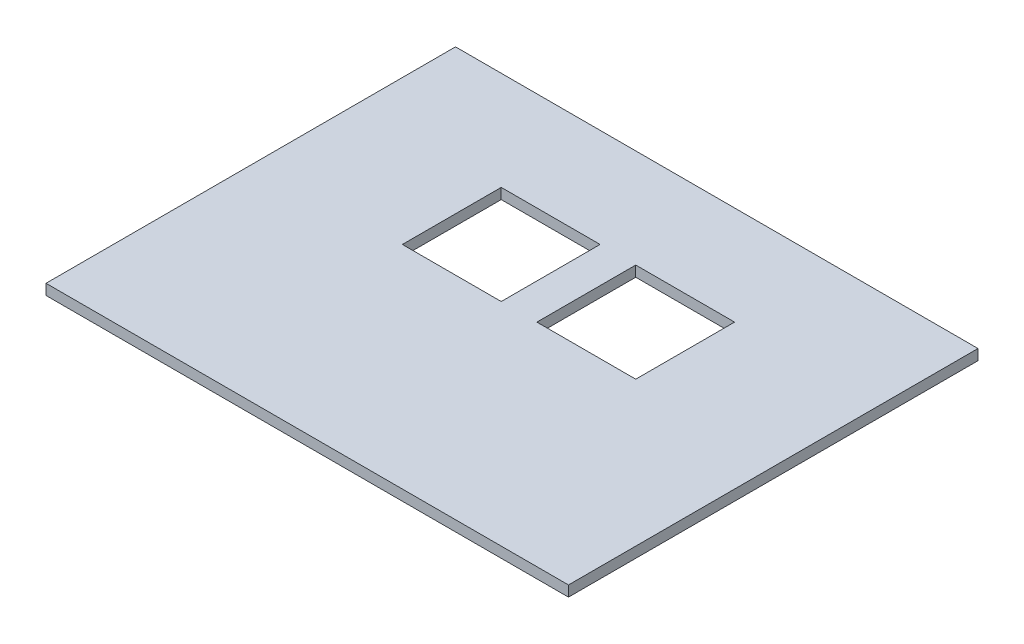
ISO-10303-21;
HEADER;
FILE_DESCRIPTION(('STEP AP214'),'2;1');
FILE_NAME('part.step','',(''),(''),'','','');
FILE_SCHEMA(('AUTOMOTIVE_DESIGN { 1 0 10303 214 1 1 1 1 }'));
ENDSEC;
DATA;
#1=APPLICATION_CONTEXT('core data for automotive mechanical design processes');
#2=APPLICATION_PROTOCOL_DEFINITION('international standard','automotive_design',2000,#1);
#3=PRODUCT_CONTEXT('',#1,'mechanical');
#4=PRODUCT('Part','Part','',(#3));
#5=PRODUCT_RELATED_PRODUCT_CATEGORY('part','',(#4));
#6=PRODUCT_DEFINITION_FORMATION('','',#4);
#7=PRODUCT_DEFINITION_CONTEXT('part definition',#1,'design');
#8=PRODUCT_DEFINITION('design','',#6,#7);
#9=PRODUCT_DEFINITION_SHAPE('','',#8);
#10=(LENGTH_UNIT() NAMED_UNIT(*) SI_UNIT(.MILLI.,.METRE.));
#11=(NAMED_UNIT(*) PLANE_ANGLE_UNIT() SI_UNIT($,.RADIAN.));
#12=(NAMED_UNIT(*) SI_UNIT($,.STERADIAN.) SOLID_ANGLE_UNIT());
#13=UNCERTAINTY_MEASURE_WITH_UNIT(LENGTH_MEASURE(1.E-05),#10,'distance_accuracy_value','');
#14=(GEOMETRIC_REPRESENTATION_CONTEXT(3) GLOBAL_UNCERTAINTY_ASSIGNED_CONTEXT((#13)) GLOBAL_UNIT_ASSIGNED_CONTEXT((#10,
#11,#12)) REPRESENTATION_CONTEXT('',''));
#15=CARTESIAN_POINT('',(0.,0.,0.));
#16=DIRECTION('',(0.,0.,1.));
#17=DIRECTION('',(1.,0.,0.));
#18=AXIS2_PLACEMENT_3D('',#15,#16,#17);
#19=CARTESIAN_POINT('',(0.,0.,0.));
#20=DIRECTION('',(0.,-1.,0.));
#21=DIRECTION('',(0.,0.,-1.));
#22=AXIS2_PLACEMENT_3D('',#19,#20,#21);
#23=PLANE('',#22);
#24=DIRECTION('',(0.,0.,-1.));
#25=VECTOR('',#24,1.);
#26=CARTESIAN_POINT('',(37.,0.,29.));
#27=LINE('',#26,#25);
#28=CARTESIAN_POINT('',(37.,0.,29.));
#29=VERTEX_POINT('',#28);
#30=CARTESIAN_POINT('',(37.,0.,-29.));
#31=VERTEX_POINT('',#30);
#32=EDGE_CURVE('E302',#29,#31,#27,.T.);
#33=ORIENTED_EDGE('',*,*,#32,.F.);
#34=DIRECTION('',(1.,0.,0.));
#35=VECTOR('',#34,1.);
#36=CARTESIAN_POINT('',(-37.,0.,29.));
#37=LINE('',#36,#35);
#38=CARTESIAN_POINT('',(-37.,0.,29.));
#39=VERTEX_POINT('',#38);
#40=EDGE_CURVE('E307',#39,#29,#37,.T.);
#41=ORIENTED_EDGE('',*,*,#40,.F.);
#42=DIRECTION('',(0.,0.,1.));
#43=VECTOR('',#42,1.);
#44=CARTESIAN_POINT('',(-37.,0.,29.));
#45=LINE('',#44,#43);
#46=CARTESIAN_POINT('',(-37.,0.,-29.));
#47=VERTEX_POINT('',#46);
#48=EDGE_CURVE('E318',#47,#39,#45,.T.);
#49=ORIENTED_EDGE('',*,*,#48,.F.);
#50=DIRECTION('',(-1.,0.,0.));
#51=VECTOR('',#50,1.);
#52=CARTESIAN_POINT('',(-37.,0.,-29.));
#53=LINE('',#52,#51);
#54=EDGE_CURVE('E316',#31,#47,#53,.T.);
#55=ORIENTED_EDGE('',*,*,#54,.F.);
#56=EDGE_LOOP('',(#33,#41,#49,#55));
#57=FACE_BOUND('',#56,.T.);
#58=DIRECTION('',(-1.,0.,0.));
#59=VECTOR('',#58,1.);
#60=CARTESIAN_POINT('',(-34.9,0.,26.9));
#61=LINE('',#60,#59);
#62=CARTESIAN_POINT('',(34.9,0.,26.9));
#63=VERTEX_POINT('',#62);
#64=CARTESIAN_POINT('',(-34.9,0.,26.9));
#65=VERTEX_POINT('',#64);
#66=EDGE_CURVE('E287',#63,#65,#61,.T.);
#67=ORIENTED_EDGE('',*,*,#66,.F.);
#68=DIRECTION('',(0.,0.,1.));
#69=VECTOR('',#68,1.);
#70=CARTESIAN_POINT('',(34.9,0.,-26.9));
#71=LINE('',#70,#69);
#72=CARTESIAN_POINT('',(34.9,0.,-26.9));
#73=VERTEX_POINT('',#72);
#74=EDGE_CURVE('E273',#73,#63,#71,.T.);
#75=ORIENTED_EDGE('',*,*,#74,.F.);
#76=DIRECTION('',(1.,0.,0.));
#77=VECTOR('',#76,1.);
#78=CARTESIAN_POINT('',(-34.9,0.,-26.9));
#79=LINE('',#78,#77);
#80=CARTESIAN_POINT('',(-34.9,0.,-26.9));
#81=VERTEX_POINT('',#80);
#82=EDGE_CURVE('E278',#81,#73,#79,.T.);
#83=ORIENTED_EDGE('',*,*,#82,.F.);
#84=DIRECTION('',(0.,0.,-1.));
#85=VECTOR('',#84,1.);
#86=CARTESIAN_POINT('',(-34.9,0.,-26.9));
#87=LINE('',#86,#85);
#88=EDGE_CURVE('E289',#65,#81,#87,.T.);
#89=ORIENTED_EDGE('',*,*,#88,.F.);
#90=EDGE_LOOP('',(#67,#75,#83,#89));
#91=FACE_BOUND('',#90,.T.);
#92=ADVANCED_FACE('F57',(#57,#91),#23,.T.);
#93=CARTESIAN_POINT('',(37.,1.5,29.));
#94=DIRECTION('',(-1.,0.,0.));
#95=DIRECTION('',(0.,0.,1.));
#96=AXIS2_PLACEMENT_3D('',#93,#94,#95);
#97=PLANE('',#96);
#98=ORIENTED_EDGE('',*,*,#32,.T.);
#99=DIRECTION('',(0.,-1.,0.));
#100=VECTOR('',#99,1.);
#101=CARTESIAN_POINT('',(37.,1.5,-29.));
#102=LINE('',#101,#100);
#103=CARTESIAN_POINT('',(37.,1.5,-29.));
#104=VERTEX_POINT('',#103);
#105=EDGE_CURVE('E329',#104,#31,#102,.T.);
#106=ORIENTED_EDGE('',*,*,#105,.F.);
#107=DIRECTION('',(0.,0.,-1.));
#108=VECTOR('',#107,1.);
#109=CARTESIAN_POINT('',(37.,1.5,29.));
#110=LINE('',#109,#108);
#111=CARTESIAN_POINT('',(37.,1.5,29.));
#112=VERTEX_POINT('',#111);
#113=EDGE_CURVE('E303',#112,#104,#110,.T.);
#114=ORIENTED_EDGE('',*,*,#113,.F.);
#115=DIRECTION('',(0.,-1.,0.));
#116=VECTOR('',#115,1.);
#117=CARTESIAN_POINT('',(37.,1.5,29.));
#118=LINE('',#117,#116);
#119=EDGE_CURVE('E313',#112,#29,#118,.T.);
#120=ORIENTED_EDGE('',*,*,#119,.T.);
#121=EDGE_LOOP('',(#98,#106,#114,#120));
#122=FACE_BOUND('',#121,.T.);
#123=ADVANCED_FACE('F59',(#122),#97,.F.);
#124=CARTESIAN_POINT('',(-37.,1.5,-29.));
#125=DIRECTION('',(0.,0.,1.));
#126=DIRECTION('',(1.,0.,0.));
#127=AXIS2_PLACEMENT_3D('',#124,#125,#126);
#128=PLANE('',#127);
#129=ORIENTED_EDGE('',*,*,#54,.T.);
#130=DIRECTION('',(0.,-1.,0.));
#131=VECTOR('',#130,1.);
#132=CARTESIAN_POINT('',(-37.,1.5,-29.));
#133=LINE('',#132,#131);
#134=CARTESIAN_POINT('',(-37.,1.5,-29.));
#135=VERTEX_POINT('',#134);
#136=EDGE_CURVE('E326',#135,#47,#133,.T.);
#137=ORIENTED_EDGE('',*,*,#136,.F.);
#138=DIRECTION('',(-1.,0.,0.));
#139=VECTOR('',#138,1.);
#140=CARTESIAN_POINT('',(-37.,1.5,-29.));
#141=LINE('',#140,#139);
#142=EDGE_CURVE('E306',#104,#135,#141,.T.);
#143=ORIENTED_EDGE('',*,*,#142,.F.);
#144=ORIENTED_EDGE('',*,*,#105,.T.);
#145=EDGE_LOOP('',(#129,#137,#143,#144));
#146=FACE_BOUND('',#145,.T.);
#147=ADVANCED_FACE('F371',(#146),#128,.F.);
#148=CARTESIAN_POINT('',(-37.,1.5,29.));
#149=DIRECTION('',(1.,0.,0.));
#150=DIRECTION('',(0.,0.,-1.));
#151=AXIS2_PLACEMENT_3D('',#148,#149,#150);
#152=PLANE('',#151);
#153=ORIENTED_EDGE('',*,*,#48,.T.);
#154=DIRECTION('',(0.,-1.,0.));
#155=VECTOR('',#154,1.);
#156=CARTESIAN_POINT('',(-37.,1.5,29.));
#157=LINE('',#156,#155);
#158=CARTESIAN_POINT('',(-37.,1.5,29.));
#159=VERTEX_POINT('',#158);
#160=EDGE_CURVE('E323',#159,#39,#157,.T.);
#161=ORIENTED_EDGE('',*,*,#160,.F.);
#162=DIRECTION('',(0.,0.,1.));
#163=VECTOR('',#162,1.);
#164=CARTESIAN_POINT('',(-37.,1.5,29.));
#165=LINE('',#164,#163);
#166=EDGE_CURVE('E309',#135,#159,#165,.T.);
#167=ORIENTED_EDGE('',*,*,#166,.F.);
#168=ORIENTED_EDGE('',*,*,#136,.T.);
#169=EDGE_LOOP('',(#153,#161,#167,#168));
#170=FACE_BOUND('',#169,.T.);
#171=ADVANCED_FACE('F428',(#170),#152,.F.);
#172=CARTESIAN_POINT('',(-37.,1.5,29.));
#173=DIRECTION('',(0.,0.,-1.));
#174=DIRECTION('',(-1.,0.,0.));
#175=AXIS2_PLACEMENT_3D('',#172,#173,#174);
#176=PLANE('',#175);
#177=ORIENTED_EDGE('',*,*,#40,.T.);
#178=ORIENTED_EDGE('',*,*,#119,.F.);
#179=DIRECTION('',(1.,0.,0.));
#180=VECTOR('',#179,1.);
#181=CARTESIAN_POINT('',(-37.,1.5,29.));
#182=LINE('',#181,#180);
#183=EDGE_CURVE('E311',#159,#112,#182,.T.);
#184=ORIENTED_EDGE('',*,*,#183,.F.);
#185=ORIENTED_EDGE('',*,*,#160,.T.);
#186=EDGE_LOOP('',(#177,#178,#184,#185));
#187=FACE_BOUND('',#186,.T.);
#188=ADVANCED_FACE('F424',(#187),#176,.F.);
#189=CARTESIAN_POINT('',(0.,1.5,0.));
#190=DIRECTION('',(0.,-1.,0.));
#191=DIRECTION('',(0.,0.,-1.));
#192=AXIS2_PLACEMENT_3D('',#189,#190,#191);
#193=PLANE('',#192);
#194=DIRECTION('',(1.,0.,0.));
#195=VECTOR('',#194,1.);
#196=CARTESIAN_POINT('',(-16.525,1.5,-0.999999999999997));
#197=LINE('',#196,#195);
#198=CARTESIAN_POINT('',(-16.525,1.5,-0.999999999999997));
#199=VERTEX_POINT('',#198);
#200=CARTESIAN_POINT('',(-2.525,1.5,-0.999999999999997));
#201=VERTEX_POINT('',#200);
#202=EDGE_CURVE('E210',#199,#201,#197,.T.);
#203=ORIENTED_EDGE('',*,*,#202,.F.);
#204=DIRECTION('',(0.,0.,1.));
#205=VECTOR('',#204,1.);
#206=CARTESIAN_POINT('',(-16.525,1.5,-0.999999999999997));
#207=LINE('',#206,#205);
#208=CARTESIAN_POINT('',(-16.525,1.5,-15.));
#209=VERTEX_POINT('',#208);
#210=EDGE_CURVE('E72',#209,#199,#207,.T.);
#211=ORIENTED_EDGE('',*,*,#210,.F.);
#212=DIRECTION('',(-1.,0.,0.));
#213=VECTOR('',#212,1.);
#214=CARTESIAN_POINT('',(-16.525,1.5,-15.));
#215=LINE('',#214,#213);
#216=CARTESIAN_POINT('',(-2.525,1.5,-15.));
#217=VERTEX_POINT('',#216);
#218=EDGE_CURVE('E217',#217,#209,#215,.T.);
#219=ORIENTED_EDGE('',*,*,#218,.F.);
#220=DIRECTION('',(0.,0.,-1.));
#221=VECTOR('',#220,1.);
#222=CARTESIAN_POINT('',(-2.525,1.5,-0.999999999999997));
#223=LINE('',#222,#221);
#224=EDGE_CURVE('E200',#201,#217,#223,.T.);
#225=ORIENTED_EDGE('',*,*,#224,.F.);
#226=EDGE_LOOP('',(#203,#211,#219,#225));
#227=FACE_BOUND('',#226,.T.);
#228=DIRECTION('',(1.,0.,0.));
#229=VECTOR('',#228,1.);
#230=CARTESIAN_POINT('',(2.525,1.5,-0.999999999999997));
#231=LINE('',#230,#229);
#232=CARTESIAN_POINT('',(2.525,1.5,-0.999999999999997));
#233=VERTEX_POINT('',#232);
#234=CARTESIAN_POINT('',(16.525,1.5,-0.999999999999997));
#235=VERTEX_POINT('',#234);
#236=EDGE_CURVE('E228',#233,#235,#231,.T.);
#237=ORIENTED_EDGE('',*,*,#236,.F.);
#238=DIRECTION('',(0.,0.,1.));
#239=VECTOR('',#238,1.);
#240=CARTESIAN_POINT('',(2.525,1.5,-0.999999999999997));
#241=LINE('',#240,#239);
#242=CARTESIAN_POINT('',(2.525,1.5,-15.));
#243=VERTEX_POINT('',#242);
#244=EDGE_CURVE('E80',#243,#233,#241,.T.);
#245=ORIENTED_EDGE('',*,*,#244,.F.);
#246=DIRECTION('',(-1.,0.,0.));
#247=VECTOR('',#246,1.);
#248=CARTESIAN_POINT('',(2.525,1.5,-15.));
#249=LINE('',#248,#247);
#250=CARTESIAN_POINT('',(16.525,1.5,-15.));
#251=VERTEX_POINT('',#250);
#252=EDGE_CURVE('E234',#251,#243,#249,.T.);
#253=ORIENTED_EDGE('',*,*,#252,.F.);
#254=DIRECTION('',(0.,0.,-1.));
#255=VECTOR('',#254,1.);
#256=CARTESIAN_POINT('',(16.525,1.5,-0.999999999999997));
#257=LINE('',#256,#255);
#258=EDGE_CURVE('E231',#235,#251,#257,.T.);
#259=ORIENTED_EDGE('',*,*,#258,.F.);
#260=EDGE_LOOP('',(#237,#245,#253,#259));
#261=FACE_BOUND('',#260,.T.);
#262=ORIENTED_EDGE('',*,*,#113,.T.);
#263=ORIENTED_EDGE('',*,*,#142,.T.);
#264=ORIENTED_EDGE('',*,*,#166,.T.);
#265=ORIENTED_EDGE('',*,*,#183,.T.);
#266=EDGE_LOOP('',(#262,#263,#264,#265));
#267=FACE_BOUND('',#266,.T.);
#268=ADVANCED_FACE('F214',(#227,#261,#267),#193,.F.);
#269=CARTESIAN_POINT('',(0.,-2.,0.));
#270=DIRECTION('',(0.,-1.,0.));
#271=DIRECTION('',(0.,0.,-1.));
#272=AXIS2_PLACEMENT_3D('',#269,#270,#271);
#273=PLANE('',#272);
#274=DIRECTION('',(0.,0.,1.));
#275=VECTOR('',#274,1.);
#276=CARTESIAN_POINT('',(34.9,-2.,-26.9));
#277=LINE('',#276,#275);
#278=CARTESIAN_POINT('',(34.9,-2.,-26.9));
#279=VERTEX_POINT('',#278);
#280=CARTESIAN_POINT('',(34.9,-2.,26.9));
#281=VERTEX_POINT('',#280);
#282=EDGE_CURVE('E274',#279,#281,#277,.T.);
#283=ORIENTED_EDGE('',*,*,#282,.T.);
#284=DIRECTION('',(-1.,0.,0.));
#285=VECTOR('',#284,1.);
#286=CARTESIAN_POINT('',(-34.9,-2.,26.9));
#287=LINE('',#286,#285);
#288=CARTESIAN_POINT('',(-34.9,-2.,26.9));
#289=VERTEX_POINT('',#288);
#290=EDGE_CURVE('E277',#281,#289,#287,.T.);
#291=ORIENTED_EDGE('',*,*,#290,.T.);
#292=DIRECTION('',(0.,0.,-1.));
#293=VECTOR('',#292,1.);
#294=CARTESIAN_POINT('',(-34.9,-2.,-26.9));
#295=LINE('',#294,#293);
#296=CARTESIAN_POINT('',(-34.9,-2.,-26.9));
#297=VERTEX_POINT('',#296);
#298=EDGE_CURVE('E280',#289,#297,#295,.T.);
#299=ORIENTED_EDGE('',*,*,#298,.T.);
#300=DIRECTION('',(1.,0.,0.));
#301=VECTOR('',#300,1.);
#302=CARTESIAN_POINT('',(-34.9,-2.,-26.9));
#303=LINE('',#302,#301);
#304=EDGE_CURVE('E282',#297,#279,#303,.T.);
#305=ORIENTED_EDGE('',*,*,#304,.T.);
#306=EDGE_LOOP('',(#283,#291,#299,#305));
#307=FACE_BOUND('',#306,.T.);
#308=DIRECTION('',(-1.,0.,0.));
#309=VECTOR('',#308,1.);
#310=CARTESIAN_POINT('',(0.,-2.,24.9));
#311=LINE('',#310,#309);
#312=CARTESIAN_POINT('',(32.9,-2.,24.9));
#313=VERTEX_POINT('',#312);
#314=CARTESIAN_POINT('',(-32.9,-2.,24.9));
#315=VERTEX_POINT('',#314);
#316=EDGE_CURVE('E247',#313,#315,#311,.T.);
#317=ORIENTED_EDGE('',*,*,#316,.F.);
#318=DIRECTION('',(0.,0.,1.));
#319=VECTOR('',#318,1.);
#320=CARTESIAN_POINT('',(32.9,-2.,0.));
#321=LINE('',#320,#319);
#322=CARTESIAN_POINT('',(32.9,-2.,-24.9));
#323=VERTEX_POINT('',#322);
#324=EDGE_CURVE('E245',#323,#313,#321,.T.);
#325=ORIENTED_EDGE('',*,*,#324,.F.);
#326=DIRECTION('',(1.,0.,0.));
#327=VECTOR('',#326,1.);
#328=CARTESIAN_POINT('',(0.,-2.,-24.9));
#329=LINE('',#328,#327);
#330=CARTESIAN_POINT('',(-32.9,-2.,-24.9));
#331=VERTEX_POINT('',#330);
#332=EDGE_CURVE('E253',#331,#323,#329,.T.);
#333=ORIENTED_EDGE('',*,*,#332,.F.);
#334=DIRECTION('',(0.,0.,-1.));
#335=VECTOR('',#334,1.);
#336=CARTESIAN_POINT('',(-32.9,-2.,0.));
#337=LINE('',#336,#335);
#338=EDGE_CURVE('E250',#315,#331,#337,.T.);
#339=ORIENTED_EDGE('',*,*,#338,.F.);
#340=EDGE_LOOP('',(#317,#325,#333,#339));
#341=FACE_BOUND('',#340,.T.);
#342=ADVANCED_FACE('F405',(#307,#341),#273,.T.);
#343=CARTESIAN_POINT('',(34.9,-2.,-26.9));
#344=DIRECTION('',(-1.,0.,0.));
#345=DIRECTION('',(0.,0.,1.));
#346=AXIS2_PLACEMENT_3D('',#343,#344,#345);
#347=PLANE('',#346);
#348=ORIENTED_EDGE('',*,*,#74,.T.);
#349=DIRECTION('',(0.,1.,0.));
#350=VECTOR('',#349,1.);
#351=CARTESIAN_POINT('',(34.9,-2.,26.9));
#352=LINE('',#351,#350);
#353=EDGE_CURVE('E300',#281,#63,#352,.T.);
#354=ORIENTED_EDGE('',*,*,#353,.F.);
#355=ORIENTED_EDGE('',*,*,#282,.F.);
#356=DIRECTION('',(0.,1.,0.));
#357=VECTOR('',#356,1.);
#358=CARTESIAN_POINT('',(34.9,-2.,-26.9));
#359=LINE('',#358,#357);
#360=EDGE_CURVE('E284',#279,#73,#359,.T.);
#361=ORIENTED_EDGE('',*,*,#360,.T.);
#362=EDGE_LOOP('',(#348,#354,#355,#361));
#363=FACE_BOUND('',#362,.T.);
#364=ADVANCED_FACE('F408',(#363),#347,.F.);
#365=CARTESIAN_POINT('',(-34.9,-2.,26.9));
#366=DIRECTION('',(0.,0.,-1.));
#367=DIRECTION('',(-1.,0.,0.));
#368=AXIS2_PLACEMENT_3D('',#365,#366,#367);
#369=PLANE('',#368);
#370=ORIENTED_EDGE('',*,*,#66,.T.);
#371=DIRECTION('',(0.,1.,0.));
#372=VECTOR('',#371,1.);
#373=CARTESIAN_POINT('',(-34.9,-2.,26.9));
#374=LINE('',#373,#372);
#375=EDGE_CURVE('E297',#289,#65,#374,.T.);
#376=ORIENTED_EDGE('',*,*,#375,.F.);
#377=ORIENTED_EDGE('',*,*,#290,.F.);
#378=ORIENTED_EDGE('',*,*,#353,.T.);
#379=EDGE_LOOP('',(#370,#376,#377,#378));
#380=FACE_BOUND('',#379,.T.);
#381=ADVANCED_FACE('F416',(#380),#369,.F.);
#382=CARTESIAN_POINT('',(-34.9,-2.,-26.9));
#383=DIRECTION('',(1.,0.,0.));
#384=DIRECTION('',(0.,0.,-1.));
#385=AXIS2_PLACEMENT_3D('',#382,#383,#384);
#386=PLANE('',#385);
#387=ORIENTED_EDGE('',*,*,#88,.T.);
#388=DIRECTION('',(0.,1.,0.));
#389=VECTOR('',#388,1.);
#390=CARTESIAN_POINT('',(-34.9,-2.,-26.9));
#391=LINE('',#390,#389);
#392=EDGE_CURVE('E295',#297,#81,#391,.T.);
#393=ORIENTED_EDGE('',*,*,#392,.F.);
#394=ORIENTED_EDGE('',*,*,#298,.F.);
#395=ORIENTED_EDGE('',*,*,#375,.T.);
#396=EDGE_LOOP('',(#387,#393,#394,#395));
#397=FACE_BOUND('',#396,.T.);
#398=ADVANCED_FACE('F412',(#397),#386,.F.);
#399=CARTESIAN_POINT('',(-34.9,-2.,-26.9));
#400=DIRECTION('',(0.,0.,1.));
#401=DIRECTION('',(1.,0.,0.));
#402=AXIS2_PLACEMENT_3D('',#399,#400,#401);
#403=PLANE('',#402);
#404=ORIENTED_EDGE('',*,*,#82,.T.);
#405=ORIENTED_EDGE('',*,*,#360,.F.);
#406=ORIENTED_EDGE('',*,*,#304,.F.);
#407=ORIENTED_EDGE('',*,*,#392,.T.);
#408=EDGE_LOOP('',(#404,#405,#406,#407));
#409=FACE_BOUND('',#408,.T.);
#410=ADVANCED_FACE('F403',(#409),#403,.F.);
#411=CARTESIAN_POINT('',(32.9,-2.,0.));
#412=DIRECTION('',(-1.,0.,0.));
#413=DIRECTION('',(0.,0.,1.));
#414=AXIS2_PLACEMENT_3D('',#411,#412,#413);
#415=PLANE('',#414);
#416=DIRECTION('',(0.,0.,1.));
#417=VECTOR('',#416,1.);
#418=CARTESIAN_POINT('',(32.9,0.,0.));
#419=LINE('',#418,#417);
#420=CARTESIAN_POINT('',(32.9,0.,-24.9));
#421=VERTEX_POINT('',#420);
#422=CARTESIAN_POINT('',(32.9,0.,24.9));
#423=VERTEX_POINT('',#422);
#424=EDGE_CURVE('E224',#421,#423,#419,.T.);
#425=ORIENTED_EDGE('',*,*,#424,.F.);
#426=DIRECTION('',(0.,1.,0.));
#427=VECTOR('',#426,1.);
#428=CARTESIAN_POINT('',(32.9,-2.,-24.9));
#429=LINE('',#428,#427);
#430=EDGE_CURVE('E255',#323,#421,#429,.T.);
#431=ORIENTED_EDGE('',*,*,#430,.F.);
#432=ORIENTED_EDGE('',*,*,#324,.T.);
#433=DIRECTION('',(0.,1.,0.));
#434=VECTOR('',#433,1.);
#435=CARTESIAN_POINT('',(32.9,-2.,24.9));
#436=LINE('',#435,#434);
#437=EDGE_CURVE('E270',#313,#423,#436,.T.);
#438=ORIENTED_EDGE('',*,*,#437,.T.);
#439=EDGE_LOOP('',(#425,#431,#432,#438));
#440=FACE_BOUND('',#439,.T.);
#441=ADVANCED_FACE('F399',(#440),#415,.T.);
#442=CARTESIAN_POINT('',(0.,-2.,24.9));
#443=DIRECTION('',(0.,0.,-1.));
#444=DIRECTION('',(-1.,0.,0.));
#445=AXIS2_PLACEMENT_3D('',#442,#443,#444);
#446=PLANE('',#445);
#447=DIRECTION('',(-1.,0.,0.));
#448=VECTOR('',#447,1.);
#449=CARTESIAN_POINT('',(0.,0.,24.9));
#450=LINE('',#449,#448);
#451=CARTESIAN_POINT('',(-32.9,0.,24.9));
#452=VERTEX_POINT('',#451);
#453=EDGE_CURVE('E257',#423,#452,#450,.T.);
#454=ORIENTED_EDGE('',*,*,#453,.F.);
#455=ORIENTED_EDGE('',*,*,#437,.F.);
#456=ORIENTED_EDGE('',*,*,#316,.T.);
#457=DIRECTION('',(0.,1.,0.));
#458=VECTOR('',#457,1.);
#459=CARTESIAN_POINT('',(-32.9,-2.,24.9));
#460=LINE('',#459,#458);
#461=EDGE_CURVE('E267',#315,#452,#460,.T.);
#462=ORIENTED_EDGE('',*,*,#461,.T.);
#463=EDGE_LOOP('',(#454,#455,#456,#462));
#464=FACE_BOUND('',#463,.T.);
#465=ADVANCED_FACE('F392',(#464),#446,.T.);
#466=CARTESIAN_POINT('',(-32.9,-2.,0.));
#467=DIRECTION('',(1.,0.,0.));
#468=DIRECTION('',(0.,0.,-1.));
#469=AXIS2_PLACEMENT_3D('',#466,#467,#468);
#470=PLANE('',#469);
#471=DIRECTION('',(0.,0.,-1.));
#472=VECTOR('',#471,1.);
#473=CARTESIAN_POINT('',(-32.9,0.,0.));
#474=LINE('',#473,#472);
#475=CARTESIAN_POINT('',(-32.9,0.,-24.9));
#476=VERTEX_POINT('',#475);
#477=EDGE_CURVE('E259',#452,#476,#474,.T.);
#478=ORIENTED_EDGE('',*,*,#477,.F.);
#479=ORIENTED_EDGE('',*,*,#461,.F.);
#480=ORIENTED_EDGE('',*,*,#338,.T.);
#481=DIRECTION('',(0.,1.,0.));
#482=VECTOR('',#481,1.);
#483=CARTESIAN_POINT('',(-32.9,-2.,-24.9));
#484=LINE('',#483,#482);
#485=EDGE_CURVE('E264',#331,#476,#484,.T.);
#486=ORIENTED_EDGE('',*,*,#485,.T.);
#487=EDGE_LOOP('',(#478,#479,#480,#486));
#488=FACE_BOUND('',#487,.T.);
#489=ADVANCED_FACE('F386',(#488),#470,.T.);
#490=CARTESIAN_POINT('',(0.,-2.,-24.9));
#491=DIRECTION('',(0.,0.,1.));
#492=DIRECTION('',(1.,0.,0.));
#493=AXIS2_PLACEMENT_3D('',#490,#491,#492);
#494=PLANE('',#493);
#495=DIRECTION('',(1.,0.,0.));
#496=VECTOR('',#495,1.);
#497=CARTESIAN_POINT('',(0.,0.,-24.9));
#498=LINE('',#497,#496);
#499=EDGE_CURVE('E248',#476,#421,#498,.T.);
#500=ORIENTED_EDGE('',*,*,#499,.F.);
#501=ORIENTED_EDGE('',*,*,#485,.F.);
#502=ORIENTED_EDGE('',*,*,#332,.T.);
#503=ORIENTED_EDGE('',*,*,#430,.T.);
#504=EDGE_LOOP('',(#500,#501,#502,#503));
#505=FACE_BOUND('',#504,.T.);
#506=ADVANCED_FACE('F379',(#505),#494,.T.);
#507=DIRECTION('',(0.,0.,-1.));
#508=VECTOR('',#507,1.);
#509=CARTESIAN_POINT('',(-16.525,0.,0.));
#510=LINE('',#509,#508);
#511=CARTESIAN_POINT('',(-16.525,0.,-0.999999999999997));
#512=VERTEX_POINT('',#511);
#513=CARTESIAN_POINT('',(-16.525,0.,-15.));
#514=VERTEX_POINT('',#513);
#515=EDGE_CURVE('E12',#512,#514,#510,.T.);
#516=ORIENTED_EDGE('',*,*,#515,.F.);
#517=DIRECTION('',(-1.,0.,0.));
#518=VECTOR('',#517,1.);
#519=CARTESIAN_POINT('',(0.,0.,-0.999999999999997));
#520=LINE('',#519,#518);
#521=CARTESIAN_POINT('',(-2.525,0.,-0.999999999999997));
#522=VERTEX_POINT('',#521);
#523=EDGE_CURVE('E341',#522,#512,#520,.T.);
#524=ORIENTED_EDGE('',*,*,#523,.F.);
#525=DIRECTION('',(0.,0.,1.));
#526=VECTOR('',#525,1.);
#527=CARTESIAN_POINT('',(-2.525,0.,0.));
#528=LINE('',#527,#526);
#529=CARTESIAN_POINT('',(-2.525,0.,-15.));
#530=VERTEX_POINT('',#529);
#531=EDGE_CURVE('E203',#530,#522,#528,.T.);
#532=ORIENTED_EDGE('',*,*,#531,.F.);
#533=DIRECTION('',(1.,0.,0.));
#534=VECTOR('',#533,1.);
#535=CARTESIAN_POINT('',(0.,0.,-15.));
#536=LINE('',#535,#534);
#537=EDGE_CURVE('E65',#514,#530,#536,.T.);
#538=ORIENTED_EDGE('',*,*,#537,.F.);
#539=EDGE_LOOP('',(#516,#524,#532,#538));
#540=FACE_BOUND('',#539,.T.);
#541=DIRECTION('',(0.,0.,-1.));
#542=VECTOR('',#541,1.);
#543=CARTESIAN_POINT('',(2.525,0.,0.));
#544=LINE('',#543,#542);
#545=CARTESIAN_POINT('',(2.525,0.,-0.999999999999997));
#546=VERTEX_POINT('',#545);
#547=CARTESIAN_POINT('',(2.525,0.,-15.));
#548=VERTEX_POINT('',#547);
#549=EDGE_CURVE('E339',#546,#548,#544,.T.);
#550=ORIENTED_EDGE('',*,*,#549,.F.);
#551=DIRECTION('',(-1.,0.,0.));
#552=VECTOR('',#551,1.);
#553=CARTESIAN_POINT('',(0.,0.,-0.999999999999997));
#554=LINE('',#553,#552);
#555=CARTESIAN_POINT('',(16.525,0.,-0.999999999999997));
#556=VERTEX_POINT('',#555);
#557=EDGE_CURVE('E332',#556,#546,#554,.T.);
#558=ORIENTED_EDGE('',*,*,#557,.F.);
#559=DIRECTION('',(0.,0.,1.));
#560=VECTOR('',#559,1.);
#561=CARTESIAN_POINT('',(16.525,0.,0.));
#562=LINE('',#561,#560);
#563=CARTESIAN_POINT('',(16.525,0.,-15.));
#564=VERTEX_POINT('',#563);
#565=EDGE_CURVE('E334',#564,#556,#562,.T.);
#566=ORIENTED_EDGE('',*,*,#565,.F.);
#567=DIRECTION('',(1.,0.,0.));
#568=VECTOR('',#567,1.);
#569=CARTESIAN_POINT('',(0.,0.,-15.));
#570=LINE('',#569,#568);
#571=EDGE_CURVE('E337',#548,#564,#570,.T.);
#572=ORIENTED_EDGE('',*,*,#571,.F.);
#573=EDGE_LOOP('',(#550,#558,#566,#572));
#574=FACE_BOUND('',#573,.T.);
#575=ORIENTED_EDGE('',*,*,#424,.T.);
#576=ORIENTED_EDGE('',*,*,#453,.T.);
#577=ORIENTED_EDGE('',*,*,#477,.T.);
#578=ORIENTED_EDGE('',*,*,#499,.T.);
#579=EDGE_LOOP('',(#575,#576,#577,#578));
#580=FACE_BOUND('',#579,.T.);
#581=ADVANCED_FACE('F349',(#540,#574,#580),#23,.T.);
#582=CARTESIAN_POINT('',(2.525,-0.5,-0.999999999999997));
#583=DIRECTION('',(-1.,0.,0.));
#584=DIRECTION('',(0.,0.,1.));
#585=AXIS2_PLACEMENT_3D('',#582,#583,#584);
#586=PLANE('',#585);
#587=ORIENTED_EDGE('',*,*,#549,.T.);
#588=DIRECTION('',(0.,1.,0.));
#589=VECTOR('',#588,1.);
#590=CARTESIAN_POINT('',(2.525,-0.5,-15.));
#591=LINE('',#590,#589);
#592=EDGE_CURVE('E238',#548,#243,#591,.T.);
#593=ORIENTED_EDGE('',*,*,#592,.T.);
#594=ORIENTED_EDGE('',*,*,#244,.T.);
#595=DIRECTION('',(0.,1.,0.));
#596=VECTOR('',#595,1.);
#597=CARTESIAN_POINT('',(2.525,-0.5,-0.999999999999997));
#598=LINE('',#597,#596);
#599=EDGE_CURVE('E237',#546,#233,#598,.T.);
#600=ORIENTED_EDGE('',*,*,#599,.F.);
#601=EDGE_LOOP('',(#587,#593,#594,#600));
#602=FACE_BOUND('',#601,.T.);
#603=ADVANCED_FACE('F378',(#602),#586,.F.);
#604=CARTESIAN_POINT('',(2.525,-0.5,-15.));
#605=DIRECTION('',(0.,0.,-1.));
#606=DIRECTION('',(-1.,0.,0.));
#607=AXIS2_PLACEMENT_3D('',#604,#605,#606);
#608=PLANE('',#607);
#609=ORIENTED_EDGE('',*,*,#571,.T.);
#610=DIRECTION('',(0.,1.,0.));
#611=VECTOR('',#610,1.);
#612=CARTESIAN_POINT('',(16.525,-0.5,-15.));
#613=LINE('',#612,#611);
#614=EDGE_CURVE('E240',#564,#251,#613,.T.);
#615=ORIENTED_EDGE('',*,*,#614,.T.);
#616=ORIENTED_EDGE('',*,*,#252,.T.);
#617=ORIENTED_EDGE('',*,*,#592,.F.);
#618=EDGE_LOOP('',(#609,#615,#616,#617));
#619=FACE_BOUND('',#618,.T.);
#620=ADVANCED_FACE('F384',(#619),#608,.F.);
#621=CARTESIAN_POINT('',(16.525,-0.5,-0.999999999999997));
#622=DIRECTION('',(1.,0.,0.));
#623=DIRECTION('',(0.,0.,-1.));
#624=AXIS2_PLACEMENT_3D('',#621,#622,#623);
#625=PLANE('',#624);
#626=ORIENTED_EDGE('',*,*,#565,.T.);
#627=DIRECTION('',(0.,1.,0.));
#628=VECTOR('',#627,1.);
#629=CARTESIAN_POINT('',(16.525,-0.5,-0.999999999999997));
#630=LINE('',#629,#628);
#631=EDGE_CURVE('E242',#556,#235,#630,.T.);
#632=ORIENTED_EDGE('',*,*,#631,.T.);
#633=ORIENTED_EDGE('',*,*,#258,.T.);
#634=ORIENTED_EDGE('',*,*,#614,.F.);
#635=EDGE_LOOP('',(#626,#632,#633,#634));
#636=FACE_BOUND('',#635,.T.);
#637=ADVANCED_FACE('F360',(#636),#625,.F.);
#638=CARTESIAN_POINT('',(2.525,-0.5,-0.999999999999997));
#639=DIRECTION('',(0.,0.,1.));
#640=DIRECTION('',(1.,0.,0.));
#641=AXIS2_PLACEMENT_3D('',#638,#639,#640);
#642=PLANE('',#641);
#643=ORIENTED_EDGE('',*,*,#557,.T.);
#644=ORIENTED_EDGE('',*,*,#599,.T.);
#645=ORIENTED_EDGE('',*,*,#236,.T.);
#646=ORIENTED_EDGE('',*,*,#631,.F.);
#647=EDGE_LOOP('',(#643,#644,#645,#646));
#648=FACE_BOUND('',#647,.T.);
#649=ADVANCED_FACE('F353',(#648),#642,.F.);
#650=CARTESIAN_POINT('',(-16.525,-0.5,-0.999999999999997));
#651=DIRECTION('',(-1.,0.,0.));
#652=DIRECTION('',(0.,0.,1.));
#653=AXIS2_PLACEMENT_3D('',#650,#651,#652);
#654=PLANE('',#653);
#655=ORIENTED_EDGE('',*,*,#515,.T.);
#656=DIRECTION('',(0.,1.,0.));
#657=VECTOR('',#656,1.);
#658=CARTESIAN_POINT('',(-16.525,-0.5,-15.));
#659=LINE('',#658,#657);
#660=EDGE_CURVE('E222',#514,#209,#659,.T.);
#661=ORIENTED_EDGE('',*,*,#660,.T.);
#662=ORIENTED_EDGE('',*,*,#210,.T.);
#663=DIRECTION('',(0.,1.,0.));
#664=VECTOR('',#663,1.);
#665=CARTESIAN_POINT('',(-16.525,-0.5,-0.999999999999997));
#666=LINE('',#665,#664);
#667=EDGE_CURVE('E207',#512,#199,#666,.T.);
#668=ORIENTED_EDGE('',*,*,#667,.F.);
#669=EDGE_LOOP('',(#655,#661,#662,#668));
#670=FACE_BOUND('',#669,.T.);
#671=ADVANCED_FACE('F351',(#670),#654,.F.);
#672=CARTESIAN_POINT('',(-16.525,-0.5,-15.));
#673=DIRECTION('',(0.,0.,-1.));
#674=DIRECTION('',(-1.,0.,0.));
#675=AXIS2_PLACEMENT_3D('',#672,#673,#674);
#676=PLANE('',#675);
#677=ORIENTED_EDGE('',*,*,#537,.T.);
#678=DIRECTION('',(0.,1.,0.));
#679=VECTOR('',#678,1.);
#680=CARTESIAN_POINT('',(-2.525,-0.5,-15.));
#681=LINE('',#680,#679);
#682=EDGE_CURVE('E206',#530,#217,#681,.T.);
#683=ORIENTED_EDGE('',*,*,#682,.T.);
#684=ORIENTED_EDGE('',*,*,#218,.T.);
#685=ORIENTED_EDGE('',*,*,#660,.F.);
#686=EDGE_LOOP('',(#677,#683,#684,#685));
#687=FACE_BOUND('',#686,.T.);
#688=ADVANCED_FACE('F346',(#687),#676,.F.);
#689=CARTESIAN_POINT('',(-2.525,-0.5,-0.999999999999997));
#690=DIRECTION('',(1.,0.,0.));
#691=DIRECTION('',(0.,0.,-1.));
#692=AXIS2_PLACEMENT_3D('',#689,#690,#691);
#693=PLANE('',#692);
#694=ORIENTED_EDGE('',*,*,#531,.T.);
#695=DIRECTION('',(0.,1.,0.));
#696=VECTOR('',#695,1.);
#697=CARTESIAN_POINT('',(-2.525,-0.5,-0.999999999999997));
#698=LINE('',#697,#696);
#699=EDGE_CURVE('E195',#522,#201,#698,.T.);
#700=ORIENTED_EDGE('',*,*,#699,.T.);
#701=ORIENTED_EDGE('',*,*,#224,.T.);
#702=ORIENTED_EDGE('',*,*,#682,.F.);
#703=EDGE_LOOP('',(#694,#700,#701,#702));
#704=FACE_BOUND('',#703,.T.);
#705=ADVANCED_FACE('F197',(#704),#693,.F.);
#706=CARTESIAN_POINT('',(-16.525,-0.5,-0.999999999999997));
#707=DIRECTION('',(0.,0.,1.));
#708=DIRECTION('',(1.,0.,0.));
#709=AXIS2_PLACEMENT_3D('',#706,#707,#708);
#710=PLANE('',#709);
#711=ORIENTED_EDGE('',*,*,#523,.T.);
#712=ORIENTED_EDGE('',*,*,#667,.T.);
#713=ORIENTED_EDGE('',*,*,#202,.T.);
#714=ORIENTED_EDGE('',*,*,#699,.F.);
#715=EDGE_LOOP('',(#711,#712,#713,#714));
#716=FACE_BOUND('',#715,.T.);
#717=ADVANCED_FACE('F211',(#716),#710,.F.);
#718=CLOSED_SHELL('',(#92,#123,#147,#171,#188,#268,#342,#364,#381,#398,#410,#441,#465,#489,#506,
#581,#603,#620,#637,#649,#671,#688,#705,#717));
#719=MANIFOLD_SOLID_BREP('B2',#718);
#720=ADVANCED_BREP_SHAPE_REPRESENTATION('',(#18,#719),#14);
#721=SHAPE_DEFINITION_REPRESENTATION(#9,#720);
ENDSEC;
END-ISO-10303-21;
